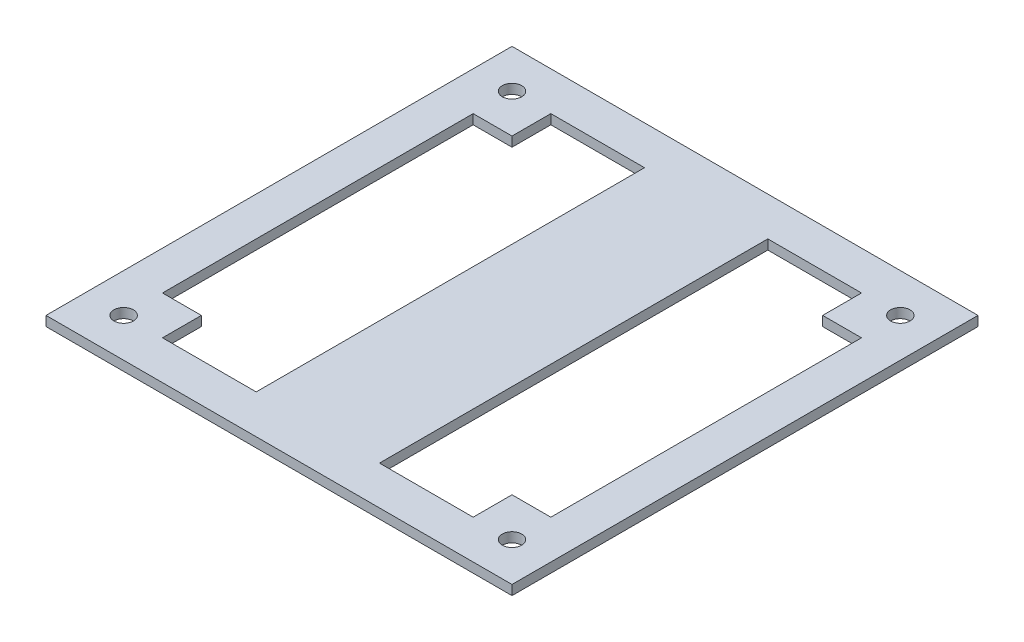
ISO-10303-21;
HEADER;
FILE_DESCRIPTION(('STEP AP214'),'2;1');
FILE_NAME('part.step','',(''),(''),'','','');
FILE_SCHEMA(('AUTOMOTIVE_DESIGN { 1 0 10303 214 1 1 1 1 }'));
ENDSEC;
DATA;
#1=APPLICATION_CONTEXT('core data for automotive mechanical design processes');
#2=APPLICATION_PROTOCOL_DEFINITION('international standard','automotive_design',2000,#1);
#3=PRODUCT_CONTEXT('',#1,'mechanical');
#4=PRODUCT('Part','Part','',(#3));
#5=PRODUCT_RELATED_PRODUCT_CATEGORY('part','',(#4));
#6=PRODUCT_DEFINITION_FORMATION('','',#4);
#7=PRODUCT_DEFINITION_CONTEXT('part definition',#1,'design');
#8=PRODUCT_DEFINITION('design','',#6,#7);
#9=PRODUCT_DEFINITION_SHAPE('','',#8);
#10=(LENGTH_UNIT() NAMED_UNIT(*) SI_UNIT(.MILLI.,.METRE.));
#11=(NAMED_UNIT(*) PLANE_ANGLE_UNIT() SI_UNIT($,.RADIAN.));
#12=(NAMED_UNIT(*) SI_UNIT($,.STERADIAN.) SOLID_ANGLE_UNIT());
#13=UNCERTAINTY_MEASURE_WITH_UNIT(LENGTH_MEASURE(1.E-05),#10,'distance_accuracy_value','');
#14=(GEOMETRIC_REPRESENTATION_CONTEXT(3) GLOBAL_UNCERTAINTY_ASSIGNED_CONTEXT((#13)) GLOBAL_UNIT_ASSIGNED_CONTEXT((#10,
#11,#12)) REPRESENTATION_CONTEXT('',''));
#15=CARTESIAN_POINT('',(0.,0.,0.));
#16=DIRECTION('',(0.,0.,1.));
#17=DIRECTION('',(1.,0.,0.));
#18=AXIS2_PLACEMENT_3D('',#15,#16,#17);
#19=CARTESIAN_POINT('',(80.,-5.,-220.));
#20=DIRECTION('',(0.,0.,-1.));
#21=DIRECTION('',(-1.,0.,0.));
#22=AXIS2_PLACEMENT_3D('',#19,#20,#21);
#23=PLANE('',#22);
#24=DIRECTION('',(-1.,0.,0.));
#25=VECTOR('',#24,1.);
#26=CARTESIAN_POINT('',(80.,0.,-220.));
#27=LINE('',#26,#25);
#28=CARTESIAN_POINT('',(80.,0.,-220.));
#29=VERTEX_POINT('',#28);
#30=CARTESIAN_POINT('',(31.75,0.,-220.));
#31=VERTEX_POINT('',#30);
#32=EDGE_CURVE('E189',#29,#31,#27,.T.);
#33=ORIENTED_EDGE('',*,*,#32,.T.);
#34=DIRECTION('',(0.,1.,0.));
#35=VECTOR('',#34,1.);
#36=CARTESIAN_POINT('',(31.75,-5.,-220.));
#37=LINE('',#36,#35);
#38=CARTESIAN_POINT('',(31.75,-5.,-220.));
#39=VERTEX_POINT('',#38);
#40=EDGE_CURVE('E64',#39,#31,#37,.T.);
#41=ORIENTED_EDGE('',*,*,#40,.F.);
#42=DIRECTION('',(-1.,0.,0.));
#43=VECTOR('',#42,1.);
#44=CARTESIAN_POINT('',(80.,-5.,-220.));
#45=LINE('',#44,#43);
#46=CARTESIAN_POINT('',(80.,-5.,-220.));
#47=VERTEX_POINT('',#46);
#48=EDGE_CURVE('E251',#47,#39,#45,.T.);
#49=ORIENTED_EDGE('',*,*,#48,.F.);
#50=DIRECTION('',(0.,1.,0.));
#51=VECTOR('',#50,1.);
#52=CARTESIAN_POINT('',(80.,-5.,-220.));
#53=LINE('',#52,#51);
#54=EDGE_CURVE('E290',#47,#29,#53,.T.);
#55=ORIENTED_EDGE('',*,*,#54,.T.);
#56=EDGE_LOOP('',(#33,#41,#49,#55));
#57=FACE_BOUND('',#56,.T.);
#58=ADVANCED_FACE('F39',(#57),#23,.F.);
#59=CARTESIAN_POINT('',(-80.,-5.,-20.));
#60=DIRECTION('',(0.,0.,1.));
#61=DIRECTION('',(1.,0.,0.));
#62=AXIS2_PLACEMENT_3D('',#59,#60,#61);
#63=PLANE('',#62);
#64=DIRECTION('',(1.,0.,0.));
#65=VECTOR('',#64,1.);
#66=CARTESIAN_POINT('',(-80.,-5.,-20.));
#67=LINE('',#66,#65);
#68=CARTESIAN_POINT('',(31.75,-5.,-20.));
#69=VERTEX_POINT('',#68);
#70=CARTESIAN_POINT('',(79.9999999999999,-5.,-20.));
#71=VERTEX_POINT('',#70);
#72=EDGE_CURVE('E232',#69,#71,#67,.T.);
#73=ORIENTED_EDGE('',*,*,#72,.F.);
#74=DIRECTION('',(0.,1.,0.));
#75=VECTOR('',#74,1.);
#76=CARTESIAN_POINT('',(31.75,-5.,-20.));
#77=LINE('',#76,#75);
#78=CARTESIAN_POINT('',(31.75,0.,-20.));
#79=VERTEX_POINT('',#78);
#80=EDGE_CURVE('E216',#69,#79,#77,.T.);
#81=ORIENTED_EDGE('',*,*,#80,.T.);
#82=DIRECTION('',(1.,0.,0.));
#83=VECTOR('',#82,1.);
#84=CARTESIAN_POINT('',(-80.,0.,-20.));
#85=LINE('',#84,#83);
#86=CARTESIAN_POINT('',(79.9999999999999,0.,-20.));
#87=VERTEX_POINT('',#86);
#88=EDGE_CURVE('E267',#79,#87,#85,.T.);
#89=ORIENTED_EDGE('',*,*,#88,.T.);
#90=DIRECTION('',(0.,1.,0.));
#91=VECTOR('',#90,1.);
#92=CARTESIAN_POINT('',(79.9999999999999,-5.,-20.));
#93=LINE('',#92,#91);
#94=EDGE_CURVE('E300',#71,#87,#93,.T.);
#95=ORIENTED_EDGE('',*,*,#94,.F.);
#96=EDGE_LOOP('',(#73,#81,#89,#95));
#97=FACE_BOUND('',#96,.T.);
#98=ADVANCED_FACE('F361',(#97),#63,.F.);
#99=CARTESIAN_POINT('',(-120.,-5.,-240.));
#100=DIRECTION('',(-1.,0.,0.));
#101=DIRECTION('',(0.,0.,1.));
#102=AXIS2_PLACEMENT_3D('',#99,#100,#101);
#103=PLANE('',#102);
#104=DIRECTION('',(0.,0.,1.));
#105=VECTOR('',#104,1.);
#106=CARTESIAN_POINT('',(-120.,0.,-240.));
#107=LINE('',#106,#105);
#108=CARTESIAN_POINT('',(-120.,0.,-240.));
#109=VERTEX_POINT('',#108);
#110=CARTESIAN_POINT('',(-120.,0.,0.));
#111=VERTEX_POINT('',#110);
#112=EDGE_CURVE('E287',#109,#111,#107,.T.);
#113=ORIENTED_EDGE('',*,*,#112,.F.);
#114=DIRECTION('',(0.,1.,0.));
#115=VECTOR('',#114,1.);
#116=CARTESIAN_POINT('',(-120.,-5.,-240.));
#117=LINE('',#116,#115);
#118=CARTESIAN_POINT('',(-120.,-5.,-240.));
#119=VERTEX_POINT('',#118);
#120=EDGE_CURVE('E11',#119,#109,#117,.T.);
#121=ORIENTED_EDGE('',*,*,#120,.F.);
#122=DIRECTION('',(0.,0.,1.));
#123=VECTOR('',#122,1.);
#124=CARTESIAN_POINT('',(-120.,-5.,-240.));
#125=LINE('',#124,#123);
#126=CARTESIAN_POINT('',(-120.,-5.,0.));
#127=VERTEX_POINT('',#126);
#128=EDGE_CURVE('E311',#119,#127,#125,.T.);
#129=ORIENTED_EDGE('',*,*,#128,.T.);
#130=DIRECTION('',(0.,1.,0.));
#131=VECTOR('',#130,1.);
#132=CARTESIAN_POINT('',(-120.,-5.,0.));
#133=LINE('',#132,#131);
#134=EDGE_CURVE('E43',#127,#111,#133,.T.);
#135=ORIENTED_EDGE('',*,*,#134,.T.);
#136=EDGE_LOOP('',(#113,#121,#129,#135));
#137=FACE_BOUND('',#136,.T.);
#138=ADVANCED_FACE('F41',(#137),#103,.T.);
#139=CARTESIAN_POINT('',(120.,-5.,-240.));
#140=DIRECTION('',(0.,0.,-1.));
#141=DIRECTION('',(-1.,0.,0.));
#142=AXIS2_PLACEMENT_3D('',#139,#140,#141);
#143=PLANE('',#142);
#144=DIRECTION('',(-1.,0.,0.));
#145=VECTOR('',#144,1.);
#146=CARTESIAN_POINT('',(120.,0.,-240.));
#147=LINE('',#146,#145);
#148=CARTESIAN_POINT('',(120.,0.,-240.));
#149=VERTEX_POINT('',#148);
#150=EDGE_CURVE('E315',#149,#109,#147,.T.);
#151=ORIENTED_EDGE('',*,*,#150,.F.);
#152=DIRECTION('',(0.,1.,0.));
#153=VECTOR('',#152,1.);
#154=CARTESIAN_POINT('',(120.,-5.,-240.));
#155=LINE('',#154,#153);
#156=CARTESIAN_POINT('',(120.,-5.,-240.));
#157=VERTEX_POINT('',#156);
#158=EDGE_CURVE('E48',#157,#149,#155,.T.);
#159=ORIENTED_EDGE('',*,*,#158,.F.);
#160=DIRECTION('',(-1.,0.,0.));
#161=VECTOR('',#160,1.);
#162=CARTESIAN_POINT('',(120.,-5.,-240.));
#163=LINE('',#162,#161);
#164=EDGE_CURVE('E321',#157,#119,#163,.T.);
#165=ORIENTED_EDGE('',*,*,#164,.T.);
#166=ORIENTED_EDGE('',*,*,#120,.T.);
#167=EDGE_LOOP('',(#151,#159,#165,#166));
#168=FACE_BOUND('',#167,.T.);
#169=ADVANCED_FACE('F346',(#168),#143,.T.);
#170=CARTESIAN_POINT('',(120.,-5.,0.));
#171=DIRECTION('',(1.,0.,0.));
#172=DIRECTION('',(0.,0.,-1.));
#173=AXIS2_PLACEMENT_3D('',#170,#171,#172);
#174=PLANE('',#173);
#175=DIRECTION('',(0.,0.,-1.));
#176=VECTOR('',#175,1.);
#177=CARTESIAN_POINT('',(120.,0.,0.));
#178=LINE('',#177,#176);
#179=CARTESIAN_POINT('',(120.,0.,0.));
#180=VERTEX_POINT('',#179);
#181=EDGE_CURVE('E329',#180,#149,#178,.T.);
#182=ORIENTED_EDGE('',*,*,#181,.F.);
#183=DIRECTION('',(0.,1.,0.));
#184=VECTOR('',#183,1.);
#185=CARTESIAN_POINT('',(120.,-5.,0.));
#186=LINE('',#185,#184);
#187=CARTESIAN_POINT('',(120.,-5.,0.));
#188=VERTEX_POINT('',#187);
#189=EDGE_CURVE('E334',#188,#180,#186,.T.);
#190=ORIENTED_EDGE('',*,*,#189,.F.);
#191=DIRECTION('',(0.,0.,-1.));
#192=VECTOR('',#191,1.);
#193=CARTESIAN_POINT('',(120.,-5.,0.));
#194=LINE('',#193,#192);
#195=EDGE_CURVE('E318',#188,#157,#194,.T.);
#196=ORIENTED_EDGE('',*,*,#195,.T.);
#197=ORIENTED_EDGE('',*,*,#158,.T.);
#198=EDGE_LOOP('',(#182,#190,#196,#197));
#199=FACE_BOUND('',#198,.T.);
#200=ADVANCED_FACE('F352',(#199),#174,.T.);
#201=CARTESIAN_POINT('',(-120.,-5.,0.));
#202=DIRECTION('',(0.,0.,1.));
#203=DIRECTION('',(1.,0.,0.));
#204=AXIS2_PLACEMENT_3D('',#201,#202,#203);
#205=PLANE('',#204);
#206=DIRECTION('',(1.,0.,0.));
#207=VECTOR('',#206,1.);
#208=CARTESIAN_POINT('',(-120.,0.,0.));
#209=LINE('',#208,#207);
#210=EDGE_CURVE('E326',#111,#180,#209,.T.);
#211=ORIENTED_EDGE('',*,*,#210,.F.);
#212=ORIENTED_EDGE('',*,*,#134,.F.);
#213=DIRECTION('',(1.,0.,0.));
#214=VECTOR('',#213,1.);
#215=CARTESIAN_POINT('',(-120.,-5.,0.));
#216=LINE('',#215,#214);
#217=EDGE_CURVE('E314',#127,#188,#216,.T.);
#218=ORIENTED_EDGE('',*,*,#217,.T.);
#219=ORIENTED_EDGE('',*,*,#189,.T.);
#220=EDGE_LOOP('',(#211,#212,#218,#219));
#221=FACE_BOUND('',#220,.T.);
#222=ADVANCED_FACE('F342',(#221),#205,.T.);
#223=CARTESIAN_POINT('',(0.,-5.,0.));
#224=DIRECTION('',(0.,1.,0.));
#225=DIRECTION('',(0.,0.,1.));
#226=AXIS2_PLACEMENT_3D('',#223,#224,#225);
#227=PLANE('',#226);
#228=CARTESIAN_POINT('',(-99.9999999999999,-5.,-20.));
#229=DIRECTION('',(0.,1.,0.));
#230=DIRECTION('',(0.,0.,1.));
#231=AXIS2_PLACEMENT_3D('',#228,#229,#230);
#232=CIRCLE('',#231,4.99999999999999);
#233=CARTESIAN_POINT('',(-99.9999999999999,-5.,-15.));
#234=VERTEX_POINT('',#233);
#235=EDGE_CURVE('E418',#234,#234,#232,.T.);
#236=ORIENTED_EDGE('',*,*,#235,.T.);
#237=EDGE_LOOP('',(#236));
#238=FACE_BOUND('',#237,.T.);
#239=CARTESIAN_POINT('',(100.,-5.,-220.));
#240=DIRECTION('',(0.,1.,0.));
#241=DIRECTION('',(0.,0.,1.));
#242=AXIS2_PLACEMENT_3D('',#239,#240,#241);
#243=CIRCLE('',#242,4.99999999999999);
#244=CARTESIAN_POINT('',(100.,-5.,-215.));
#245=VERTEX_POINT('',#244);
#246=EDGE_CURVE('E420',#245,#245,#243,.T.);
#247=ORIENTED_EDGE('',*,*,#246,.T.);
#248=EDGE_LOOP('',(#247));
#249=FACE_BOUND('',#248,.T.);
#250=CARTESIAN_POINT('',(-99.9999999999999,-5.,-220.));
#251=DIRECTION('',(0.,1.,0.));
#252=DIRECTION('',(0.,0.,1.));
#253=AXIS2_PLACEMENT_3D('',#250,#251,#252);
#254=CIRCLE('',#253,4.99999999999999);
#255=CARTESIAN_POINT('',(-99.9999999999999,-5.,-215.));
#256=VERTEX_POINT('',#255);
#257=EDGE_CURVE('E425',#256,#256,#254,.T.);
#258=ORIENTED_EDGE('',*,*,#257,.T.);
#259=EDGE_LOOP('',(#258));
#260=FACE_BOUND('',#259,.T.);
#261=CARTESIAN_POINT('',(99.9999999999999,-5.,-20.));
#262=DIRECTION('',(0.,1.,0.));
#263=DIRECTION('',(0.,0.,1.));
#264=AXIS2_PLACEMENT_3D('',#261,#262,#263);
#265=CIRCLE('',#264,4.99999999999999);
#266=CARTESIAN_POINT('',(99.9999999999999,-5.,-15.));
#267=VERTEX_POINT('',#266);
#268=EDGE_CURVE('E203',#267,#267,#265,.T.);
#269=ORIENTED_EDGE('',*,*,#268,.T.);
#270=EDGE_LOOP('',(#269));
#271=FACE_BOUND('',#270,.T.);
#272=DIRECTION('',(0.,0.,1.));
#273=VECTOR('',#272,1.);
#274=CARTESIAN_POINT('',(-31.75,-5.,-220.));
#275=LINE('',#274,#273);
#276=CARTESIAN_POINT('',(-31.75,-5.,-220.));
#277=VERTEX_POINT('',#276);
#278=CARTESIAN_POINT('',(-31.75,-5.,-20.));
#279=VERTEX_POINT('',#278);
#280=EDGE_CURVE('E206',#277,#279,#275,.T.);
#281=ORIENTED_EDGE('',*,*,#280,.F.);
#282=CARTESIAN_POINT('',(-79.9999999999999,-5.,-220.));
#283=VERTEX_POINT('',#282);
#284=EDGE_CURVE('E56',#277,#283,#45,.T.);
#285=ORIENTED_EDGE('',*,*,#284,.T.);
#286=DIRECTION('',(0.,0.,1.));
#287=VECTOR('',#286,1.);
#288=CARTESIAN_POINT('',(-79.9999999999999,-5.,-200.));
#289=LINE('',#288,#287);
#290=CARTESIAN_POINT('',(-79.9999999999999,-5.,-200.));
#291=VERTEX_POINT('',#290);
#292=EDGE_CURVE('E253',#283,#291,#289,.T.);
#293=ORIENTED_EDGE('',*,*,#292,.T.);
#294=DIRECTION('',(-1.,0.,0.));
#295=VECTOR('',#294,1.);
#296=CARTESIAN_POINT('',(-99.9999999999999,-5.,-200.));
#297=LINE('',#296,#295);
#298=CARTESIAN_POINT('',(-99.9999999999999,-5.,-200.));
#299=VERTEX_POINT('',#298);
#300=EDGE_CURVE('E220',#291,#299,#297,.T.);
#301=ORIENTED_EDGE('',*,*,#300,.T.);
#302=DIRECTION('',(0.,0.,1.));
#303=VECTOR('',#302,1.);
#304=CARTESIAN_POINT('',(-99.9999999999999,-5.,-200.));
#305=LINE('',#304,#303);
#306=CARTESIAN_POINT('',(-99.9999999999999,-5.,-40.));
#307=VERTEX_POINT('',#306);
#308=EDGE_CURVE('E223',#299,#307,#305,.T.);
#309=ORIENTED_EDGE('',*,*,#308,.T.);
#310=DIRECTION('',(1.,0.,0.));
#311=VECTOR('',#310,1.);
#312=CARTESIAN_POINT('',(-99.9999999999999,-5.,-40.));
#313=LINE('',#312,#311);
#314=CARTESIAN_POINT('',(-80.,-5.,-40.));
#315=VERTEX_POINT('',#314);
#316=EDGE_CURVE('E226',#307,#315,#313,.T.);
#317=ORIENTED_EDGE('',*,*,#316,.T.);
#318=DIRECTION('',(0.,0.,1.));
#319=VECTOR('',#318,1.);
#320=CARTESIAN_POINT('',(-80.,-5.,-40.));
#321=LINE('',#320,#319);
#322=CARTESIAN_POINT('',(-80.,-5.,-20.));
#323=VERTEX_POINT('',#322);
#324=EDGE_CURVE('E229',#315,#323,#321,.T.);
#325=ORIENTED_EDGE('',*,*,#324,.T.);
#326=EDGE_CURVE('E233',#323,#279,#67,.T.);
#327=ORIENTED_EDGE('',*,*,#326,.T.);
#328=EDGE_LOOP('',(#281,#285,#293,#301,#309,#317,#325,#327));
#329=FACE_BOUND('',#328,.T.);
#330=ORIENTED_EDGE('',*,*,#48,.T.);
#331=DIRECTION('',(0.,0.,-1.));
#332=VECTOR('',#331,1.);
#333=CARTESIAN_POINT('',(31.75,-5.,-220.));
#334=LINE('',#333,#332);
#335=EDGE_CURVE('E198',#69,#39,#334,.T.);
#336=ORIENTED_EDGE('',*,*,#335,.F.);
#337=ORIENTED_EDGE('',*,*,#72,.T.);
#338=DIRECTION('',(0.,0.,-1.));
#339=VECTOR('',#338,1.);
#340=CARTESIAN_POINT('',(79.9999999999999,-5.,-40.));
#341=LINE('',#340,#339);
#342=CARTESIAN_POINT('',(79.9999999999999,-5.,-40.));
#343=VERTEX_POINT('',#342);
#344=EDGE_CURVE('E236',#71,#343,#341,.T.);
#345=ORIENTED_EDGE('',*,*,#344,.T.);
#346=DIRECTION('',(1.,0.,0.));
#347=VECTOR('',#346,1.);
#348=CARTESIAN_POINT('',(99.9999999999999,-5.,-40.));
#349=LINE('',#348,#347);
#350=CARTESIAN_POINT('',(99.9999999999999,-5.,-40.));
#351=VERTEX_POINT('',#350);
#352=EDGE_CURVE('E239',#343,#351,#349,.T.);
#353=ORIENTED_EDGE('',*,*,#352,.T.);
#354=DIRECTION('',(0.,0.,-1.));
#355=VECTOR('',#354,1.);
#356=CARTESIAN_POINT('',(99.9999999999999,-5.,-40.));
#357=LINE('',#356,#355);
#358=CARTESIAN_POINT('',(100.,-5.,-200.));
#359=VERTEX_POINT('',#358);
#360=EDGE_CURVE('E242',#351,#359,#357,.T.);
#361=ORIENTED_EDGE('',*,*,#360,.T.);
#362=DIRECTION('',(-1.,0.,0.));
#363=VECTOR('',#362,1.);
#364=CARTESIAN_POINT('',(80.,-5.,-200.));
#365=LINE('',#364,#363);
#366=CARTESIAN_POINT('',(80.,-5.,-200.));
#367=VERTEX_POINT('',#366);
#368=EDGE_CURVE('E245',#359,#367,#365,.T.);
#369=ORIENTED_EDGE('',*,*,#368,.T.);
#370=DIRECTION('',(0.,0.,-1.));
#371=VECTOR('',#370,1.);
#372=CARTESIAN_POINT('',(80.,-5.,-220.));
#373=LINE('',#372,#371);
#374=EDGE_CURVE('E248',#367,#47,#373,.T.);
#375=ORIENTED_EDGE('',*,*,#374,.T.);
#376=EDGE_LOOP('',(#330,#336,#337,#345,#353,#361,#369,#375));
#377=FACE_BOUND('',#376,.T.);
#378=ORIENTED_EDGE('',*,*,#128,.F.);
#379=ORIENTED_EDGE('',*,*,#164,.F.);
#380=ORIENTED_EDGE('',*,*,#195,.F.);
#381=ORIENTED_EDGE('',*,*,#217,.F.);
#382=EDGE_LOOP('',(#378,#379,#380,#381));
#383=FACE_BOUND('',#382,.T.);
#384=ADVANCED_FACE('F349',(#238,#249,#260,#271,#329,#377,#383),#227,.F.);
#385=CARTESIAN_POINT('',(0.,0.,0.));
#386=DIRECTION('',(0.,1.,0.));
#387=DIRECTION('',(0.,0.,1.));
#388=AXIS2_PLACEMENT_3D('',#385,#386,#387);
#389=PLANE('',#388);
#390=CARTESIAN_POINT('',(-99.9999999999999,0.,-20.));
#391=DIRECTION('',(0.,1.,0.));
#392=DIRECTION('',(0.,0.,1.));
#393=AXIS2_PLACEMENT_3D('',#390,#391,#392);
#394=CIRCLE('',#393,4.99999999999999);
#395=CARTESIAN_POINT('',(-99.9999999999999,0.,-15.));
#396=VERTEX_POINT('',#395);
#397=EDGE_CURVE('E415',#396,#396,#394,.T.);
#398=ORIENTED_EDGE('',*,*,#397,.F.);
#399=EDGE_LOOP('',(#398));
#400=FACE_BOUND('',#399,.T.);
#401=CARTESIAN_POINT('',(100.,0.,-220.));
#402=DIRECTION('',(0.,1.,0.));
#403=DIRECTION('',(0.,0.,-1.));
#404=AXIS2_PLACEMENT_3D('',#401,#402,#403);
#405=CIRCLE('',#404,4.99999999999999);
#406=CARTESIAN_POINT('',(100.,0.,-225.));
#407=VERTEX_POINT('',#406);
#408=EDGE_CURVE('E486',#407,#407,#405,.T.);
#409=ORIENTED_EDGE('',*,*,#408,.F.);
#410=EDGE_LOOP('',(#409));
#411=FACE_BOUND('',#410,.T.);
#412=CARTESIAN_POINT('',(-99.9999999999999,0.,-220.));
#413=DIRECTION('',(0.,1.,0.));
#414=DIRECTION('',(0.,0.,1.));
#415=AXIS2_PLACEMENT_3D('',#412,#413,#414);
#416=CIRCLE('',#415,4.99999999999999);
#417=CARTESIAN_POINT('',(-99.9999999999999,0.,-215.));
#418=VERTEX_POINT('',#417);
#419=EDGE_CURVE('E490',#418,#418,#416,.T.);
#420=ORIENTED_EDGE('',*,*,#419,.F.);
#421=EDGE_LOOP('',(#420));
#422=FACE_BOUND('',#421,.T.);
#423=CARTESIAN_POINT('',(99.9999999999999,0.,-20.));
#424=DIRECTION('',(0.,1.,0.));
#425=DIRECTION('',(0.,0.,-1.));
#426=AXIS2_PLACEMENT_3D('',#423,#424,#425);
#427=CIRCLE('',#426,4.99999999999999);
#428=CARTESIAN_POINT('',(99.9999999999999,0.,-25.));
#429=VERTEX_POINT('',#428);
#430=EDGE_CURVE('E209',#429,#429,#427,.T.);
#431=ORIENTED_EDGE('',*,*,#430,.F.);
#432=EDGE_LOOP('',(#431));
#433=FACE_BOUND('',#432,.T.);
#434=CARTESIAN_POINT('',(-31.75,0.,-220.));
#435=VERTEX_POINT('',#434);
#436=CARTESIAN_POINT('',(-79.9999999999999,0.,-220.));
#437=VERTEX_POINT('',#436);
#438=EDGE_CURVE('E179',#435,#437,#27,.T.);
#439=ORIENTED_EDGE('',*,*,#438,.F.);
#440=DIRECTION('',(0.,0.,1.));
#441=VECTOR('',#440,1.);
#442=CARTESIAN_POINT('',(-31.75,0.,-220.));
#443=LINE('',#442,#441);
#444=CARTESIAN_POINT('',(-31.75,0.,-20.));
#445=VERTEX_POINT('',#444);
#446=EDGE_CURVE('E184',#435,#445,#443,.T.);
#447=ORIENTED_EDGE('',*,*,#446,.T.);
#448=CARTESIAN_POINT('',(-80.,0.,-20.));
#449=VERTEX_POINT('',#448);
#450=EDGE_CURVE('E268',#449,#445,#85,.T.);
#451=ORIENTED_EDGE('',*,*,#450,.F.);
#452=DIRECTION('',(0.,0.,1.));
#453=VECTOR('',#452,1.);
#454=CARTESIAN_POINT('',(-80.,0.,-40.));
#455=LINE('',#454,#453);
#456=CARTESIAN_POINT('',(-80.,0.,-40.));
#457=VERTEX_POINT('',#456);
#458=EDGE_CURVE('E264',#457,#449,#455,.T.);
#459=ORIENTED_EDGE('',*,*,#458,.F.);
#460=DIRECTION('',(1.,0.,0.));
#461=VECTOR('',#460,1.);
#462=CARTESIAN_POINT('',(-99.9999999999999,0.,-40.));
#463=LINE('',#462,#461);
#464=CARTESIAN_POINT('',(-99.9999999999999,0.,-40.));
#465=VERTEX_POINT('',#464);
#466=EDGE_CURVE('E261',#465,#457,#463,.T.);
#467=ORIENTED_EDGE('',*,*,#466,.F.);
#468=DIRECTION('',(0.,0.,1.));
#469=VECTOR('',#468,1.);
#470=CARTESIAN_POINT('',(-99.9999999999999,0.,-200.));
#471=LINE('',#470,#469);
#472=CARTESIAN_POINT('',(-99.9999999999999,0.,-200.));
#473=VERTEX_POINT('',#472);
#474=EDGE_CURVE('E258',#473,#465,#471,.T.);
#475=ORIENTED_EDGE('',*,*,#474,.F.);
#476=DIRECTION('',(-1.,0.,0.));
#477=VECTOR('',#476,1.);
#478=CARTESIAN_POINT('',(-99.9999999999999,0.,-200.));
#479=LINE('',#478,#477);
#480=CARTESIAN_POINT('',(-79.9999999999999,0.,-200.));
#481=VERTEX_POINT('',#480);
#482=EDGE_CURVE('E215',#481,#473,#479,.T.);
#483=ORIENTED_EDGE('',*,*,#482,.F.);
#484=DIRECTION('',(0.,0.,1.));
#485=VECTOR('',#484,1.);
#486=CARTESIAN_POINT('',(-79.9999999999999,0.,-200.));
#487=LINE('',#486,#485);
#488=EDGE_CURVE('E187',#437,#481,#487,.T.);
#489=ORIENTED_EDGE('',*,*,#488,.F.);
#490=EDGE_LOOP('',(#439,#447,#451,#459,#467,#475,#483,#489));
#491=FACE_BOUND('',#490,.T.);
#492=DIRECTION('',(0.,0.,-1.));
#493=VECTOR('',#492,1.);
#494=CARTESIAN_POINT('',(31.75,0.,-220.));
#495=LINE('',#494,#493);
#496=EDGE_CURVE('E202',#79,#31,#495,.T.);
#497=ORIENTED_EDGE('',*,*,#496,.T.);
#498=ORIENTED_EDGE('',*,*,#32,.F.);
#499=DIRECTION('',(0.,0.,-1.));
#500=VECTOR('',#499,1.);
#501=CARTESIAN_POINT('',(80.,0.,-220.));
#502=LINE('',#501,#500);
#503=CARTESIAN_POINT('',(80.,0.,-200.));
#504=VERTEX_POINT('',#503);
#505=EDGE_CURVE('E190',#504,#29,#502,.T.);
#506=ORIENTED_EDGE('',*,*,#505,.F.);
#507=DIRECTION('',(-1.,0.,0.));
#508=VECTOR('',#507,1.);
#509=CARTESIAN_POINT('',(80.,0.,-200.));
#510=LINE('',#509,#508);
#511=CARTESIAN_POINT('',(100.,0.,-200.));
#512=VERTEX_POINT('',#511);
#513=EDGE_CURVE('E279',#512,#504,#510,.T.);
#514=ORIENTED_EDGE('',*,*,#513,.F.);
#515=DIRECTION('',(0.,0.,-1.));
#516=VECTOR('',#515,1.);
#517=CARTESIAN_POINT('',(99.9999999999999,0.,-40.));
#518=LINE('',#517,#516);
#519=CARTESIAN_POINT('',(99.9999999999999,0.,-40.));
#520=VERTEX_POINT('',#519);
#521=EDGE_CURVE('E276',#520,#512,#518,.T.);
#522=ORIENTED_EDGE('',*,*,#521,.F.);
#523=DIRECTION('',(1.,0.,0.));
#524=VECTOR('',#523,1.);
#525=CARTESIAN_POINT('',(99.9999999999999,0.,-40.));
#526=LINE('',#525,#524);
#527=CARTESIAN_POINT('',(79.9999999999999,0.,-40.));
#528=VERTEX_POINT('',#527);
#529=EDGE_CURVE('E273',#528,#520,#526,.T.);
#530=ORIENTED_EDGE('',*,*,#529,.F.);
#531=DIRECTION('',(0.,0.,-1.));
#532=VECTOR('',#531,1.);
#533=CARTESIAN_POINT('',(79.9999999999999,0.,-40.));
#534=LINE('',#533,#532);
#535=EDGE_CURVE('E270',#87,#528,#534,.T.);
#536=ORIENTED_EDGE('',*,*,#535,.F.);
#537=ORIENTED_EDGE('',*,*,#88,.F.);
#538=EDGE_LOOP('',(#497,#498,#506,#514,#522,#530,#536,#537));
#539=FACE_BOUND('',#538,.T.);
#540=ORIENTED_EDGE('',*,*,#112,.T.);
#541=ORIENTED_EDGE('',*,*,#210,.T.);
#542=ORIENTED_EDGE('',*,*,#181,.T.);
#543=ORIENTED_EDGE('',*,*,#150,.T.);
#544=EDGE_LOOP('',(#540,#541,#542,#543));
#545=FACE_BOUND('',#544,.T.);
#546=ADVANCED_FACE('F180',(#400,#411,#422,#433,#491,#539,#545),#389,.T.);
#547=CARTESIAN_POINT('',(-99.9999999999999,-5.,-200.));
#548=DIRECTION('',(0.,0.,-1.));
#549=DIRECTION('',(-1.,0.,0.));
#550=AXIS2_PLACEMENT_3D('',#547,#548,#549);
#551=PLANE('',#550);
#552=ORIENTED_EDGE('',*,*,#482,.T.);
#553=DIRECTION('',(0.,1.,0.));
#554=VECTOR('',#553,1.);
#555=CARTESIAN_POINT('',(-99.9999999999999,-5.,-200.));
#556=LINE('',#555,#554);
#557=EDGE_CURVE('E256',#299,#473,#556,.T.);
#558=ORIENTED_EDGE('',*,*,#557,.F.);
#559=ORIENTED_EDGE('',*,*,#300,.F.);
#560=DIRECTION('',(0.,1.,0.));
#561=VECTOR('',#560,1.);
#562=CARTESIAN_POINT('',(-79.9999999999999,-5.,-200.));
#563=LINE('',#562,#561);
#564=EDGE_CURVE('E285',#291,#481,#563,.T.);
#565=ORIENTED_EDGE('',*,*,#564,.T.);
#566=EDGE_LOOP('',(#552,#558,#559,#565));
#567=FACE_BOUND('',#566,.T.);
#568=ADVANCED_FACE('F380',(#567),#551,.F.);
#569=CARTESIAN_POINT('',(-79.9999999999999,-5.,-200.));
#570=DIRECTION('',(-1.,0.,0.));
#571=DIRECTION('',(0.,0.,1.));
#572=AXIS2_PLACEMENT_3D('',#569,#570,#571);
#573=PLANE('',#572);
#574=ORIENTED_EDGE('',*,*,#488,.T.);
#575=ORIENTED_EDGE('',*,*,#564,.F.);
#576=ORIENTED_EDGE('',*,*,#292,.F.);
#577=DIRECTION('',(0.,1.,0.));
#578=VECTOR('',#577,1.);
#579=CARTESIAN_POINT('',(-79.9999999999999,-5.,-220.));
#580=LINE('',#579,#578);
#581=EDGE_CURVE('E288',#283,#437,#580,.T.);
#582=ORIENTED_EDGE('',*,*,#581,.T.);
#583=EDGE_LOOP('',(#574,#575,#576,#582));
#584=FACE_BOUND('',#583,.T.);
#585=ADVANCED_FACE('F373',(#584),#573,.F.);
#586=ORIENTED_EDGE('',*,*,#284,.F.);
#587=DIRECTION('',(0.,1.,0.));
#588=VECTOR('',#587,1.);
#589=CARTESIAN_POINT('',(-31.75,-5.,-220.));
#590=LINE('',#589,#588);
#591=EDGE_CURVE('E192',#277,#435,#590,.T.);
#592=ORIENTED_EDGE('',*,*,#591,.T.);
#593=ORIENTED_EDGE('',*,*,#438,.T.);
#594=ORIENTED_EDGE('',*,*,#581,.F.);
#595=EDGE_LOOP('',(#586,#592,#593,#594));
#596=FACE_BOUND('',#595,.T.);
#597=ADVANCED_FACE('F193',(#596),#23,.F.);
#598=CARTESIAN_POINT('',(80.,-5.,-220.));
#599=DIRECTION('',(1.,0.,0.));
#600=DIRECTION('',(0.,0.,-1.));
#601=AXIS2_PLACEMENT_3D('',#598,#599,#600);
#602=PLANE('',#601);
#603=ORIENTED_EDGE('',*,*,#505,.T.);
#604=ORIENTED_EDGE('',*,*,#54,.F.);
#605=ORIENTED_EDGE('',*,*,#374,.F.);
#606=DIRECTION('',(0.,1.,0.));
#607=VECTOR('',#606,1.);
#608=CARTESIAN_POINT('',(80.,-5.,-200.));
#609=LINE('',#608,#607);
#610=EDGE_CURVE('E292',#367,#504,#609,.T.);
#611=ORIENTED_EDGE('',*,*,#610,.T.);
#612=EDGE_LOOP('',(#603,#604,#605,#611));
#613=FACE_BOUND('',#612,.T.);
#614=ADVANCED_FACE('F372',(#613),#602,.F.);
#615=CARTESIAN_POINT('',(80.,-5.,-200.));
#616=DIRECTION('',(0.,0.,-1.));
#617=DIRECTION('',(-1.,0.,0.));
#618=AXIS2_PLACEMENT_3D('',#615,#616,#617);
#619=PLANE('',#618);
#620=ORIENTED_EDGE('',*,*,#513,.T.);
#621=ORIENTED_EDGE('',*,*,#610,.F.);
#622=ORIENTED_EDGE('',*,*,#368,.F.);
#623=DIRECTION('',(0.,1.,0.));
#624=VECTOR('',#623,1.);
#625=CARTESIAN_POINT('',(100.,-5.,-200.));
#626=LINE('',#625,#624);
#627=EDGE_CURVE('E294',#359,#512,#626,.T.);
#628=ORIENTED_EDGE('',*,*,#627,.T.);
#629=EDGE_LOOP('',(#620,#621,#622,#628));
#630=FACE_BOUND('',#629,.T.);
#631=ADVANCED_FACE('F378',(#630),#619,.F.);
#632=CARTESIAN_POINT('',(99.9999999999999,-5.,-40.));
#633=DIRECTION('',(1.,0.,0.));
#634=DIRECTION('',(0.,0.,-1.));
#635=AXIS2_PLACEMENT_3D('',#632,#633,#634);
#636=PLANE('',#635);
#637=ORIENTED_EDGE('',*,*,#521,.T.);
#638=ORIENTED_EDGE('',*,*,#627,.F.);
#639=ORIENTED_EDGE('',*,*,#360,.F.);
#640=DIRECTION('',(0.,1.,0.));
#641=VECTOR('',#640,1.);
#642=CARTESIAN_POINT('',(99.9999999999999,-5.,-40.));
#643=LINE('',#642,#641);
#644=EDGE_CURVE('E296',#351,#520,#643,.T.);
#645=ORIENTED_EDGE('',*,*,#644,.T.);
#646=EDGE_LOOP('',(#637,#638,#639,#645));
#647=FACE_BOUND('',#646,.T.);
#648=ADVANCED_FACE('F449',(#647),#636,.F.);
#649=CARTESIAN_POINT('',(99.9999999999999,-5.,-40.));
#650=DIRECTION('',(0.,0.,1.));
#651=DIRECTION('',(1.,0.,0.));
#652=AXIS2_PLACEMENT_3D('',#649,#650,#651);
#653=PLANE('',#652);
#654=ORIENTED_EDGE('',*,*,#529,.T.);
#655=ORIENTED_EDGE('',*,*,#644,.F.);
#656=ORIENTED_EDGE('',*,*,#352,.F.);
#657=DIRECTION('',(0.,1.,0.));
#658=VECTOR('',#657,1.);
#659=CARTESIAN_POINT('',(79.9999999999999,-5.,-40.));
#660=LINE('',#659,#658);
#661=EDGE_CURVE('E298',#343,#528,#660,.T.);
#662=ORIENTED_EDGE('',*,*,#661,.T.);
#663=EDGE_LOOP('',(#654,#655,#656,#662));
#664=FACE_BOUND('',#663,.T.);
#665=ADVANCED_FACE('F446',(#664),#653,.F.);
#666=CARTESIAN_POINT('',(79.9999999999999,-5.,-40.));
#667=DIRECTION('',(1.,0.,0.));
#668=DIRECTION('',(0.,0.,-1.));
#669=AXIS2_PLACEMENT_3D('',#666,#667,#668);
#670=PLANE('',#669);
#671=ORIENTED_EDGE('',*,*,#535,.T.);
#672=ORIENTED_EDGE('',*,*,#661,.F.);
#673=ORIENTED_EDGE('',*,*,#344,.F.);
#674=ORIENTED_EDGE('',*,*,#94,.T.);
#675=EDGE_LOOP('',(#671,#672,#673,#674));
#676=FACE_BOUND('',#675,.T.);
#677=ADVANCED_FACE('F442',(#676),#670,.F.);
#678=ORIENTED_EDGE('',*,*,#450,.T.);
#679=DIRECTION('',(0.,1.,0.));
#680=VECTOR('',#679,1.);
#681=CARTESIAN_POINT('',(-31.75,-5.,-20.));
#682=LINE('',#681,#680);
#683=EDGE_CURVE('E197',#279,#445,#682,.T.);
#684=ORIENTED_EDGE('',*,*,#683,.F.);
#685=ORIENTED_EDGE('',*,*,#326,.F.);
#686=DIRECTION('',(0.,1.,0.));
#687=VECTOR('',#686,1.);
#688=CARTESIAN_POINT('',(-80.,-5.,-20.));
#689=LINE('',#688,#687);
#690=EDGE_CURVE('E303',#323,#449,#689,.T.);
#691=ORIENTED_EDGE('',*,*,#690,.T.);
#692=EDGE_LOOP('',(#678,#684,#685,#691));
#693=FACE_BOUND('',#692,.T.);
#694=ADVANCED_FACE('F368',(#693),#63,.F.);
#695=CARTESIAN_POINT('',(-80.,-5.,-40.));
#696=DIRECTION('',(-1.,0.,0.));
#697=DIRECTION('',(0.,0.,1.));
#698=AXIS2_PLACEMENT_3D('',#695,#696,#697);
#699=PLANE('',#698);
#700=ORIENTED_EDGE('',*,*,#458,.T.);
#701=ORIENTED_EDGE('',*,*,#690,.F.);
#702=ORIENTED_EDGE('',*,*,#324,.F.);
#703=DIRECTION('',(0.,1.,0.));
#704=VECTOR('',#703,1.);
#705=CARTESIAN_POINT('',(-80.,-5.,-40.));
#706=LINE('',#705,#704);
#707=EDGE_CURVE('E305',#315,#457,#706,.T.);
#708=ORIENTED_EDGE('',*,*,#707,.T.);
#709=EDGE_LOOP('',(#700,#701,#702,#708));
#710=FACE_BOUND('',#709,.T.);
#711=ADVANCED_FACE('F464',(#710),#699,.F.);
#712=CARTESIAN_POINT('',(-99.9999999999999,-5.,-40.));
#713=DIRECTION('',(0.,0.,1.));
#714=DIRECTION('',(1.,0.,0.));
#715=AXIS2_PLACEMENT_3D('',#712,#713,#714);
#716=PLANE('',#715);
#717=ORIENTED_EDGE('',*,*,#466,.T.);
#718=ORIENTED_EDGE('',*,*,#707,.F.);
#719=ORIENTED_EDGE('',*,*,#316,.F.);
#720=DIRECTION('',(0.,1.,0.));
#721=VECTOR('',#720,1.);
#722=CARTESIAN_POINT('',(-99.9999999999999,-5.,-40.));
#723=LINE('',#722,#721);
#724=EDGE_CURVE('E307',#307,#465,#723,.T.);
#725=ORIENTED_EDGE('',*,*,#724,.T.);
#726=EDGE_LOOP('',(#717,#718,#719,#725));
#727=FACE_BOUND('',#726,.T.);
#728=ADVANCED_FACE('F468',(#727),#716,.F.);
#729=CARTESIAN_POINT('',(-99.9999999999999,-5.,-200.));
#730=DIRECTION('',(-1.,0.,0.));
#731=DIRECTION('',(0.,0.,1.));
#732=AXIS2_PLACEMENT_3D('',#729,#730,#731);
#733=PLANE('',#732);
#734=ORIENTED_EDGE('',*,*,#474,.T.);
#735=ORIENTED_EDGE('',*,*,#724,.F.);
#736=ORIENTED_EDGE('',*,*,#308,.F.);
#737=ORIENTED_EDGE('',*,*,#557,.T.);
#738=EDGE_LOOP('',(#734,#735,#736,#737));
#739=FACE_BOUND('',#738,.T.);
#740=ADVANCED_FACE('F394',(#739),#733,.F.);
#741=CARTESIAN_POINT('',(31.75,-5.,-220.));
#742=DIRECTION('',(1.,0.,0.));
#743=DIRECTION('',(0.,0.,-1.));
#744=AXIS2_PLACEMENT_3D('',#741,#742,#743);
#745=PLANE('',#744);
#746=ORIENTED_EDGE('',*,*,#496,.F.);
#747=ORIENTED_EDGE('',*,*,#80,.F.);
#748=ORIENTED_EDGE('',*,*,#335,.T.);
#749=ORIENTED_EDGE('',*,*,#40,.T.);
#750=EDGE_LOOP('',(#746,#747,#748,#749));
#751=FACE_BOUND('',#750,.T.);
#752=ADVANCED_FACE('F391',(#751),#745,.T.);
#753=CARTESIAN_POINT('',(-31.75,-5.,-220.));
#754=DIRECTION('',(-1.,0.,0.));
#755=DIRECTION('',(0.,0.,1.));
#756=AXIS2_PLACEMENT_3D('',#753,#754,#755);
#757=PLANE('',#756);
#758=ORIENTED_EDGE('',*,*,#446,.F.);
#759=ORIENTED_EDGE('',*,*,#591,.F.);
#760=ORIENTED_EDGE('',*,*,#280,.T.);
#761=ORIENTED_EDGE('',*,*,#683,.T.);
#762=EDGE_LOOP('',(#758,#759,#760,#761));
#763=FACE_BOUND('',#762,.T.);
#764=ADVANCED_FACE('F201',(#763),#757,.T.);
#765=CARTESIAN_POINT('',(99.9999999999999,-10.,-20.));
#766=DIRECTION('',(0.,1.,0.));
#767=DIRECTION('',(0.,0.,1.));
#768=AXIS2_PLACEMENT_3D('',#765,#766,#767);
#769=CYLINDRICAL_SURFACE('',#768,4.99999999999999);
#770=ORIENTED_EDGE('',*,*,#430,.T.);
#771=EDGE_LOOP('',(#770));
#772=FACE_BOUND('',#771,.T.);
#773=ORIENTED_EDGE('',*,*,#268,.F.);
#774=EDGE_LOOP('',(#773));
#775=FACE_BOUND('',#774,.T.);
#776=ADVANCED_FACE('F390',(#772,#775),#769,.F.);
#777=CARTESIAN_POINT('',(-99.9999999999999,-10.,-220.));
#778=DIRECTION('',(0.,1.,0.));
#779=DIRECTION('',(0.,0.,1.));
#780=AXIS2_PLACEMENT_3D('',#777,#778,#779);
#781=CYLINDRICAL_SURFACE('',#780,4.99999999999999);
#782=ORIENTED_EDGE('',*,*,#419,.T.);
#783=EDGE_LOOP('',(#782));
#784=FACE_BOUND('',#783,.T.);
#785=ORIENTED_EDGE('',*,*,#257,.F.);
#786=EDGE_LOOP('',(#785));
#787=FACE_BOUND('',#786,.T.);
#788=ADVANCED_FACE('F398',(#784,#787),#781,.F.);
#789=CARTESIAN_POINT('',(100.,-10.,-220.));
#790=DIRECTION('',(0.,1.,0.));
#791=DIRECTION('',(0.,0.,1.));
#792=AXIS2_PLACEMENT_3D('',#789,#790,#791);
#793=CYLINDRICAL_SURFACE('',#792,4.99999999999999);
#794=ORIENTED_EDGE('',*,*,#408,.T.);
#795=EDGE_LOOP('',(#794));
#796=FACE_BOUND('',#795,.T.);
#797=ORIENTED_EDGE('',*,*,#246,.F.);
#798=EDGE_LOOP('',(#797));
#799=FACE_BOUND('',#798,.T.);
#800=ADVANCED_FACE('F402',(#796,#799),#793,.F.);
#801=CARTESIAN_POINT('',(-99.9999999999999,-10.,-20.));
#802=DIRECTION('',(0.,1.,0.));
#803=DIRECTION('',(0.,0.,1.));
#804=AXIS2_PLACEMENT_3D('',#801,#802,#803);
#805=CYLINDRICAL_SURFACE('',#804,4.99999999999999);
#806=ORIENTED_EDGE('',*,*,#397,.T.);
#807=EDGE_LOOP('',(#806));
#808=FACE_BOUND('',#807,.T.);
#809=ORIENTED_EDGE('',*,*,#235,.F.);
#810=EDGE_LOOP('',(#809));
#811=FACE_BOUND('',#810,.T.);
#812=ADVANCED_FACE('F406',(#808,#811),#805,.F.);
#813=CLOSED_SHELL('',(#58,#98,#138,#169,#200,#222,#384,#546,#568,#585,#597,#614,#631,#648,#665,
#677,#694,#711,#728,#740,#752,#764,#776,#788,#800,#812));
#814=MANIFOLD_SOLID_BREP('B2',#813);
#815=ADVANCED_BREP_SHAPE_REPRESENTATION('',(#18,#814),#14);
#816=SHAPE_DEFINITION_REPRESENTATION(#9,#815);
ENDSEC;
END-ISO-10303-21;
